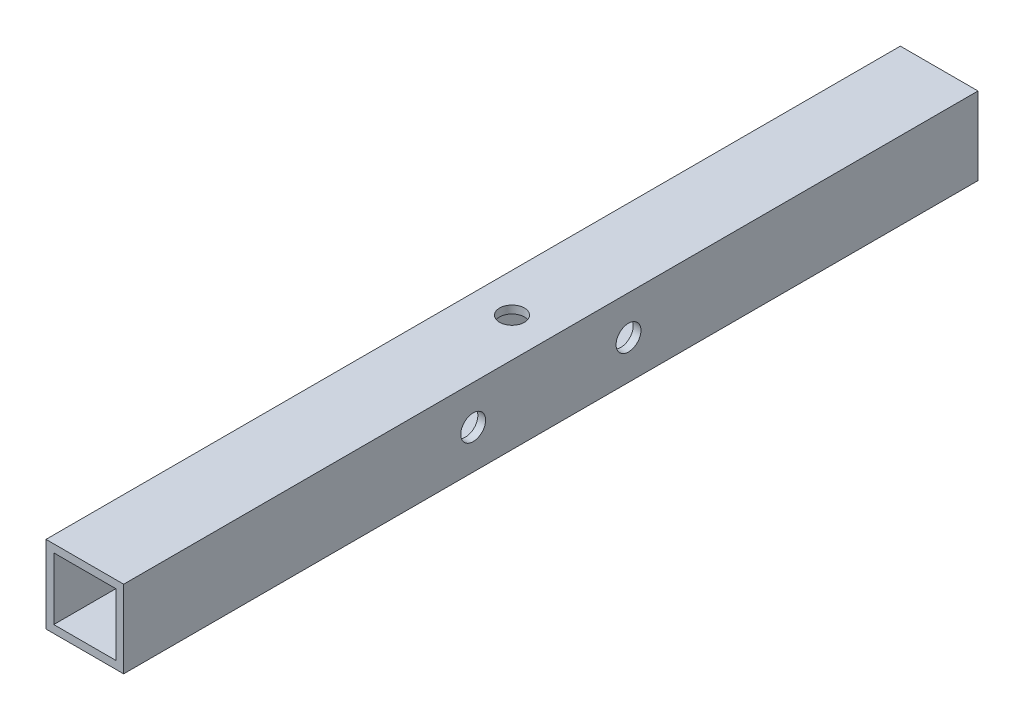
ISO-10303-21;
HEADER;
FILE_DESCRIPTION(('STEP AP214'),'2;1');
FILE_NAME('part.step','',(''),(''),'','','');
FILE_SCHEMA(('AUTOMOTIVE_DESIGN { 1 0 10303 214 1 1 1 1 }'));
ENDSEC;
DATA;
#1=APPLICATION_CONTEXT('core data for automotive mechanical design processes');
#2=APPLICATION_PROTOCOL_DEFINITION('international standard','automotive_design',2000,#1);
#3=PRODUCT_CONTEXT('',#1,'mechanical');
#4=PRODUCT('Part','Part','',(#3));
#5=PRODUCT_RELATED_PRODUCT_CATEGORY('part','',(#4));
#6=PRODUCT_DEFINITION_FORMATION('','',#4);
#7=PRODUCT_DEFINITION_CONTEXT('part definition',#1,'design');
#8=PRODUCT_DEFINITION('design','',#6,#7);
#9=PRODUCT_DEFINITION_SHAPE('','',#8);
#10=(LENGTH_UNIT() NAMED_UNIT(*) SI_UNIT(.MILLI.,.METRE.));
#11=(NAMED_UNIT(*) PLANE_ANGLE_UNIT() SI_UNIT($,.RADIAN.));
#12=(NAMED_UNIT(*) SI_UNIT($,.STERADIAN.) SOLID_ANGLE_UNIT());
#13=UNCERTAINTY_MEASURE_WITH_UNIT(LENGTH_MEASURE(1.E-05),#10,'distance_accuracy_value','');
#14=(GEOMETRIC_REPRESENTATION_CONTEXT(3) GLOBAL_UNCERTAINTY_ASSIGNED_CONTEXT((#13)) GLOBAL_UNIT_ASSIGNED_CONTEXT((#10,
#11,#12)) REPRESENTATION_CONTEXT('',''));
#15=CARTESIAN_POINT('',(0.,0.,0.));
#16=DIRECTION('',(0.,0.,1.));
#17=DIRECTION('',(1.,0.,0.));
#18=AXIS2_PLACEMENT_3D('',#15,#16,#17);
#19=CARTESIAN_POINT('',(0.,0.,110.));
#20=DIRECTION('',(0.,0.,-1.));
#21=DIRECTION('',(-1.,0.,0.));
#22=AXIS2_PLACEMENT_3D('',#19,#20,#21);
#23=PLANE('',#22);
#24=DIRECTION('',(0.,1.,0.));
#25=VECTOR('',#24,1.);
#26=CARTESIAN_POINT('',(5.,-5.,110.));
#27=LINE('',#26,#25);
#28=CARTESIAN_POINT('',(5.,-5.,110.));
#29=VERTEX_POINT('',#28);
#30=CARTESIAN_POINT('',(5.,5.,110.));
#31=VERTEX_POINT('',#30);
#32=EDGE_CURVE('E137',#29,#31,#27,.T.);
#33=ORIENTED_EDGE('',*,*,#32,.T.);
#34=DIRECTION('',(-1.,0.,0.));
#35=VECTOR('',#34,1.);
#36=CARTESIAN_POINT('',(-5.,5.,110.));
#37=LINE('',#36,#35);
#38=CARTESIAN_POINT('',(-5.,5.,110.));
#39=VERTEX_POINT('',#38);
#40=EDGE_CURVE('E140',#31,#39,#37,.T.);
#41=ORIENTED_EDGE('',*,*,#40,.T.);
#42=DIRECTION('',(0.,-1.,0.));
#43=VECTOR('',#42,1.);
#44=CARTESIAN_POINT('',(-5.,-5.,110.));
#45=LINE('',#44,#43);
#46=CARTESIAN_POINT('',(-5.,-5.,110.));
#47=VERTEX_POINT('',#46);
#48=EDGE_CURVE('E143',#39,#47,#45,.T.);
#49=ORIENTED_EDGE('',*,*,#48,.T.);
#50=DIRECTION('',(1.,0.,0.));
#51=VECTOR('',#50,1.);
#52=CARTESIAN_POINT('',(-5.,-5.,110.));
#53=LINE('',#52,#51);
#54=EDGE_CURVE('E145',#47,#29,#53,.T.);
#55=ORIENTED_EDGE('',*,*,#54,.T.);
#56=EDGE_LOOP('',(#33,#41,#49,#55));
#57=FACE_BOUND('',#56,.T.);
#58=DIRECTION('',(0.,1.,0.));
#59=VECTOR('',#58,1.);
#60=CARTESIAN_POINT('',(4.,-4.,110.));
#61=LINE('',#60,#59);
#62=CARTESIAN_POINT('',(4.,-4.,110.));
#63=VERTEX_POINT('',#62);
#64=CARTESIAN_POINT('',(4.,4.,110.));
#65=VERTEX_POINT('',#64);
#66=EDGE_CURVE('E99',#63,#65,#61,.T.);
#67=ORIENTED_EDGE('',*,*,#66,.F.);
#68=DIRECTION('',(1.,0.,0.));
#69=VECTOR('',#68,1.);
#70=CARTESIAN_POINT('',(-4.,-4.,110.));
#71=LINE('',#70,#69);
#72=CARTESIAN_POINT('',(-4.,-4.,110.));
#73=VERTEX_POINT('',#72);
#74=EDGE_CURVE('E121',#73,#63,#71,.T.);
#75=ORIENTED_EDGE('',*,*,#74,.F.);
#76=DIRECTION('',(0.,-1.,0.));
#77=VECTOR('',#76,1.);
#78=CARTESIAN_POINT('',(-4.,-4.,110.));
#79=LINE('',#78,#77);
#80=CARTESIAN_POINT('',(-4.,4.,110.));
#81=VERTEX_POINT('',#80);
#82=EDGE_CURVE('E119',#81,#73,#79,.T.);
#83=ORIENTED_EDGE('',*,*,#82,.F.);
#84=DIRECTION('',(-1.,0.,0.));
#85=VECTOR('',#84,1.);
#86=CARTESIAN_POINT('',(-4.,4.,110.));
#87=LINE('',#86,#85);
#88=EDGE_CURVE('E107',#65,#81,#87,.T.);
#89=ORIENTED_EDGE('',*,*,#88,.F.);
#90=EDGE_LOOP('',(#67,#75,#83,#89));
#91=FACE_BOUND('',#90,.T.);
#92=ADVANCED_FACE('F32',(#57,#91),#23,.F.);
#93=CARTESIAN_POINT('',(0.,0.,0.));
#94=DIRECTION('',(0.,0.,-1.));
#95=DIRECTION('',(-1.,0.,0.));
#96=AXIS2_PLACEMENT_3D('',#93,#94,#95);
#97=PLANE('',#96);
#98=DIRECTION('',(0.,1.,0.));
#99=VECTOR('',#98,1.);
#100=CARTESIAN_POINT('',(5.,-5.,0.));
#101=LINE('',#100,#99);
#102=CARTESIAN_POINT('',(5.,-5.,0.));
#103=VERTEX_POINT('',#102);
#104=CARTESIAN_POINT('',(5.,5.,0.));
#105=VERTEX_POINT('',#104);
#106=EDGE_CURVE('E115',#103,#105,#101,.T.);
#107=ORIENTED_EDGE('',*,*,#106,.F.);
#108=DIRECTION('',(1.,0.,0.));
#109=VECTOR('',#108,1.);
#110=CARTESIAN_POINT('',(-5.,-5.,0.));
#111=LINE('',#110,#109);
#112=CARTESIAN_POINT('',(-5.,-5.,0.));
#113=VERTEX_POINT('',#112);
#114=EDGE_CURVE('E141',#113,#103,#111,.T.);
#115=ORIENTED_EDGE('',*,*,#114,.F.);
#116=DIRECTION('',(0.,-1.,0.));
#117=VECTOR('',#116,1.);
#118=CARTESIAN_POINT('',(-5.,-5.,0.));
#119=LINE('',#118,#117);
#120=CARTESIAN_POINT('',(-5.,5.,0.));
#121=VERTEX_POINT('',#120);
#122=EDGE_CURVE('E152',#121,#113,#119,.T.);
#123=ORIENTED_EDGE('',*,*,#122,.F.);
#124=DIRECTION('',(-1.,0.,0.));
#125=VECTOR('',#124,1.);
#126=CARTESIAN_POINT('',(-5.,5.,0.));
#127=LINE('',#126,#125);
#128=EDGE_CURVE('E150',#105,#121,#127,.T.);
#129=ORIENTED_EDGE('',*,*,#128,.F.);
#130=EDGE_LOOP('',(#107,#115,#123,#129));
#131=FACE_BOUND('',#130,.T.);
#132=DIRECTION('',(1.,0.,0.));
#133=VECTOR('',#132,1.);
#134=CARTESIAN_POINT('',(-4.,-4.,0.));
#135=LINE('',#134,#133);
#136=CARTESIAN_POINT('',(-4.,-4.,0.));
#137=VERTEX_POINT('',#136);
#138=CARTESIAN_POINT('',(4.,-4.,0.));
#139=VERTEX_POINT('',#138);
#140=EDGE_CURVE('E108',#137,#139,#135,.T.);
#141=ORIENTED_EDGE('',*,*,#140,.T.);
#142=DIRECTION('',(0.,1.,0.));
#143=VECTOR('',#142,1.);
#144=CARTESIAN_POINT('',(4.,-4.,0.));
#145=LINE('',#144,#143);
#146=CARTESIAN_POINT('',(4.,4.,0.));
#147=VERTEX_POINT('',#146);
#148=EDGE_CURVE('E57',#139,#147,#145,.T.);
#149=ORIENTED_EDGE('',*,*,#148,.T.);
#150=DIRECTION('',(-1.,0.,0.));
#151=VECTOR('',#150,1.);
#152=CARTESIAN_POINT('',(-4.,4.,0.));
#153=LINE('',#152,#151);
#154=CARTESIAN_POINT('',(-4.,4.,0.));
#155=VERTEX_POINT('',#154);
#156=EDGE_CURVE('E114',#147,#155,#153,.T.);
#157=ORIENTED_EDGE('',*,*,#156,.T.);
#158=DIRECTION('',(0.,-1.,0.));
#159=VECTOR('',#158,1.);
#160=CARTESIAN_POINT('',(-4.,-4.,0.));
#161=LINE('',#160,#159);
#162=EDGE_CURVE('E129',#155,#137,#161,.T.);
#163=ORIENTED_EDGE('',*,*,#162,.T.);
#164=EDGE_LOOP('',(#141,#149,#157,#163));
#165=FACE_BOUND('',#164,.T.);
#166=ADVANCED_FACE('F214',(#131,#165),#97,.T.);
#167=CARTESIAN_POINT('',(5.,-5.,110.));
#168=DIRECTION('',(-1.,0.,0.));
#169=DIRECTION('',(0.,0.,1.));
#170=AXIS2_PLACEMENT_3D('',#167,#168,#169);
#171=PLANE('',#170);
#172=CARTESIAN_POINT('',(5.,0.,65.));
#173=DIRECTION('',(1.,0.,0.));
#174=DIRECTION('',(0.,0.,-1.));
#175=AXIS2_PLACEMENT_3D('',#172,#173,#174);
#176=CIRCLE('',#175,1.60000000000001);
#177=CARTESIAN_POINT('',(5.,0.,63.4));
#178=VERTEX_POINT('',#177);
#179=EDGE_CURVE('E174',#178,#178,#176,.T.);
#180=ORIENTED_EDGE('',*,*,#179,.F.);
#181=EDGE_LOOP('',(#180));
#182=FACE_BOUND('',#181,.T.);
#183=CARTESIAN_POINT('',(5.,0.,45.));
#184=DIRECTION('',(1.,0.,0.));
#185=DIRECTION('',(0.,0.,-1.));
#186=AXIS2_PLACEMENT_3D('',#183,#184,#185);
#187=CIRCLE('',#186,1.6);
#188=CARTESIAN_POINT('',(5.,0.,43.4));
#189=VERTEX_POINT('',#188);
#190=EDGE_CURVE('E184',#189,#189,#187,.T.);
#191=ORIENTED_EDGE('',*,*,#190,.F.);
#192=EDGE_LOOP('',(#191));
#193=FACE_BOUND('',#192,.T.);
#194=ORIENTED_EDGE('',*,*,#106,.T.);
#195=DIRECTION('',(0.,0.,-1.));
#196=VECTOR('',#195,1.);
#197=CARTESIAN_POINT('',(5.,5.,110.));
#198=LINE('',#197,#196);
#199=EDGE_CURVE('E11',#31,#105,#198,.T.);
#200=ORIENTED_EDGE('',*,*,#199,.F.);
#201=ORIENTED_EDGE('',*,*,#32,.F.);
#202=DIRECTION('',(0.,0.,-1.));
#203=VECTOR('',#202,1.);
#204=CARTESIAN_POINT('',(5.,-5.,110.));
#205=LINE('',#204,#203);
#206=EDGE_CURVE('E147',#29,#103,#205,.T.);
#207=ORIENTED_EDGE('',*,*,#206,.T.);
#208=EDGE_LOOP('',(#194,#200,#201,#207));
#209=FACE_BOUND('',#208,.T.);
#210=ADVANCED_FACE('F34',(#182,#193,#209),#171,.F.);
#211=CARTESIAN_POINT('',(-5.,5.,110.));
#212=DIRECTION('',(0.,-1.,0.));
#213=DIRECTION('',(0.,0.,-1.));
#214=AXIS2_PLACEMENT_3D('',#211,#212,#213);
#215=PLANE('',#214);
#216=CARTESIAN_POINT('',(0.,5.,55.));
#217=DIRECTION('',(0.,1.,0.));
#218=DIRECTION('',(0.,0.,1.));
#219=AXIS2_PLACEMENT_3D('',#216,#217,#218);
#220=CIRCLE('',#219,1.6);
#221=CARTESIAN_POINT('',(0.,5.,56.6));
#222=VERTEX_POINT('',#221);
#223=EDGE_CURVE('E190',#222,#222,#220,.T.);
#224=ORIENTED_EDGE('',*,*,#223,.F.);
#225=EDGE_LOOP('',(#224));
#226=FACE_BOUND('',#225,.T.);
#227=ORIENTED_EDGE('',*,*,#128,.T.);
#228=DIRECTION('',(0.,0.,-1.));
#229=VECTOR('',#228,1.);
#230=CARTESIAN_POINT('',(-5.,5.,110.));
#231=LINE('',#230,#229);
#232=EDGE_CURVE('E41',#39,#121,#231,.T.);
#233=ORIENTED_EDGE('',*,*,#232,.F.);
#234=ORIENTED_EDGE('',*,*,#40,.F.);
#235=ORIENTED_EDGE('',*,*,#199,.T.);
#236=EDGE_LOOP('',(#227,#233,#234,#235));
#237=FACE_BOUND('',#236,.T.);
#238=ADVANCED_FACE('F228',(#226,#237),#215,.F.);
#239=CARTESIAN_POINT('',(-5.,-5.,110.));
#240=DIRECTION('',(1.,0.,0.));
#241=DIRECTION('',(0.,0.,-1.));
#242=AXIS2_PLACEMENT_3D('',#239,#240,#241);
#243=PLANE('',#242);
#244=CARTESIAN_POINT('',(-5.,0.,65.));
#245=DIRECTION('',(1.,0.,0.));
#246=DIRECTION('',(0.,0.,-1.));
#247=AXIS2_PLACEMENT_3D('',#244,#245,#246);
#248=CIRCLE('',#247,1.60000000000001);
#249=CARTESIAN_POINT('',(-5.,0.,63.4));
#250=VERTEX_POINT('',#249);
#251=EDGE_CURVE('E168',#250,#250,#248,.T.);
#252=ORIENTED_EDGE('',*,*,#251,.T.);
#253=EDGE_LOOP('',(#252));
#254=FACE_BOUND('',#253,.T.);
#255=CARTESIAN_POINT('',(-5.,0.,45.));
#256=DIRECTION('',(1.,0.,0.));
#257=DIRECTION('',(0.,0.,-1.));
#258=AXIS2_PLACEMENT_3D('',#255,#256,#257);
#259=CIRCLE('',#258,1.6);
#260=CARTESIAN_POINT('',(-5.,0.,43.4));
#261=VERTEX_POINT('',#260);
#262=EDGE_CURVE('E179',#261,#261,#259,.T.);
#263=ORIENTED_EDGE('',*,*,#262,.T.);
#264=EDGE_LOOP('',(#263));
#265=FACE_BOUND('',#264,.T.);
#266=ORIENTED_EDGE('',*,*,#122,.T.);
#267=DIRECTION('',(0.,0.,-1.));
#268=VECTOR('',#267,1.);
#269=CARTESIAN_POINT('',(-5.,-5.,110.));
#270=LINE('',#269,#268);
#271=EDGE_CURVE('E157',#47,#113,#270,.T.);
#272=ORIENTED_EDGE('',*,*,#271,.F.);
#273=ORIENTED_EDGE('',*,*,#48,.F.);
#274=ORIENTED_EDGE('',*,*,#232,.T.);
#275=EDGE_LOOP('',(#266,#272,#273,#274));
#276=FACE_BOUND('',#275,.T.);
#277=ADVANCED_FACE('F225',(#254,#265,#276),#243,.F.);
#278=CARTESIAN_POINT('',(-5.,-5.,110.));
#279=DIRECTION('',(0.,1.,0.));
#280=DIRECTION('',(0.,0.,1.));
#281=AXIS2_PLACEMENT_3D('',#278,#279,#280);
#282=PLANE('',#281);
#283=CARTESIAN_POINT('',(0.,-5.,55.));
#284=DIRECTION('',(0.,1.,0.));
#285=DIRECTION('',(0.,0.,1.));
#286=AXIS2_PLACEMENT_3D('',#283,#284,#285);
#287=CIRCLE('',#286,1.6);
#288=CARTESIAN_POINT('',(0.,-5.,56.6));
#289=VERTEX_POINT('',#288);
#290=EDGE_CURVE('E164',#289,#289,#287,.T.);
#291=ORIENTED_EDGE('',*,*,#290,.T.);
#292=EDGE_LOOP('',(#291));
#293=FACE_BOUND('',#292,.T.);
#294=ORIENTED_EDGE('',*,*,#114,.T.);
#295=ORIENTED_EDGE('',*,*,#206,.F.);
#296=ORIENTED_EDGE('',*,*,#54,.F.);
#297=ORIENTED_EDGE('',*,*,#271,.T.);
#298=EDGE_LOOP('',(#294,#295,#296,#297));
#299=FACE_BOUND('',#298,.T.);
#300=ADVANCED_FACE('F210',(#293,#299),#282,.F.);
#301=CARTESIAN_POINT('',(4.,-4.,110.));
#302=DIRECTION('',(-1.,0.,0.));
#303=DIRECTION('',(0.,0.,1.));
#304=AXIS2_PLACEMENT_3D('',#301,#302,#303);
#305=PLANE('',#304);
#306=CARTESIAN_POINT('',(4.,0.,65.));
#307=DIRECTION('',(-1.,0.,0.));
#308=DIRECTION('',(0.,0.,1.));
#309=AXIS2_PLACEMENT_3D('',#306,#307,#308);
#310=CIRCLE('',#309,1.60000000000001);
#311=CARTESIAN_POINT('',(4.,0.,66.6));
#312=VERTEX_POINT('',#311);
#313=EDGE_CURVE('E187',#312,#312,#310,.T.);
#314=ORIENTED_EDGE('',*,*,#313,.F.);
#315=EDGE_LOOP('',(#314));
#316=FACE_BOUND('',#315,.T.);
#317=CARTESIAN_POINT('',(4.,0.,45.));
#318=DIRECTION('',(-1.,0.,0.));
#319=DIRECTION('',(0.,0.,1.));
#320=AXIS2_PLACEMENT_3D('',#317,#318,#319);
#321=CIRCLE('',#320,1.6);
#322=CARTESIAN_POINT('',(4.,0.,46.6));
#323=VERTEX_POINT('',#322);
#324=EDGE_CURVE('E167',#323,#323,#321,.T.);
#325=ORIENTED_EDGE('',*,*,#324,.F.);
#326=EDGE_LOOP('',(#325));
#327=FACE_BOUND('',#326,.T.);
#328=ORIENTED_EDGE('',*,*,#148,.F.);
#329=DIRECTION('',(0.,0.,-1.));
#330=VECTOR('',#329,1.);
#331=CARTESIAN_POINT('',(4.,-4.,110.));
#332=LINE('',#331,#330);
#333=EDGE_CURVE('E103',#63,#139,#332,.T.);
#334=ORIENTED_EDGE('',*,*,#333,.F.);
#335=ORIENTED_EDGE('',*,*,#66,.T.);
#336=DIRECTION('',(0.,0.,-1.));
#337=VECTOR('',#336,1.);
#338=CARTESIAN_POINT('',(4.,4.,110.));
#339=LINE('',#338,#337);
#340=EDGE_CURVE('E102',#65,#147,#339,.T.);
#341=ORIENTED_EDGE('',*,*,#340,.T.);
#342=EDGE_LOOP('',(#328,#334,#335,#341));
#343=FACE_BOUND('',#342,.T.);
#344=ADVANCED_FACE('F101',(#316,#327,#343),#305,.T.);
#345=CARTESIAN_POINT('',(-4.,4.,110.));
#346=DIRECTION('',(0.,-1.,0.));
#347=DIRECTION('',(0.,0.,-1.));
#348=AXIS2_PLACEMENT_3D('',#345,#346,#347);
#349=PLANE('',#348);
#350=CARTESIAN_POINT('',(0.,4.,55.));
#351=DIRECTION('',(0.,-1.,0.));
#352=DIRECTION('',(0.,0.,-1.));
#353=AXIS2_PLACEMENT_3D('',#350,#351,#352);
#354=CIRCLE('',#353,1.6);
#355=CARTESIAN_POINT('',(0.,4.,53.4));
#356=VERTEX_POINT('',#355);
#357=EDGE_CURVE('E127',#356,#356,#354,.T.);
#358=ORIENTED_EDGE('',*,*,#357,.F.);
#359=EDGE_LOOP('',(#358));
#360=FACE_BOUND('',#359,.T.);
#361=ORIENTED_EDGE('',*,*,#156,.F.);
#362=ORIENTED_EDGE('',*,*,#340,.F.);
#363=ORIENTED_EDGE('',*,*,#88,.T.);
#364=DIRECTION('',(0.,0.,-1.));
#365=VECTOR('',#364,1.);
#366=CARTESIAN_POINT('',(-4.,4.,110.));
#367=LINE('',#366,#365);
#368=EDGE_CURVE('E116',#81,#155,#367,.T.);
#369=ORIENTED_EDGE('',*,*,#368,.T.);
#370=EDGE_LOOP('',(#361,#362,#363,#369));
#371=FACE_BOUND('',#370,.T.);
#372=ADVANCED_FACE('F111',(#360,#371),#349,.T.);
#373=CARTESIAN_POINT('',(-4.,-4.,110.));
#374=DIRECTION('',(1.,0.,0.));
#375=DIRECTION('',(0.,0.,-1.));
#376=AXIS2_PLACEMENT_3D('',#373,#374,#375);
#377=PLANE('',#376);
#378=CARTESIAN_POINT('',(-4.,0.,65.));
#379=DIRECTION('',(1.,0.,0.));
#380=DIRECTION('',(0.,0.,-1.));
#381=AXIS2_PLACEMENT_3D('',#378,#379,#380);
#382=CIRCLE('',#381,1.60000000000001);
#383=CARTESIAN_POINT('',(-4.,0.,63.4));
#384=VERTEX_POINT('',#383);
#385=EDGE_CURVE('E36',#384,#384,#382,.T.);
#386=ORIENTED_EDGE('',*,*,#385,.F.);
#387=EDGE_LOOP('',(#386));
#388=FACE_BOUND('',#387,.T.);
#389=CARTESIAN_POINT('',(-4.,0.,45.));
#390=DIRECTION('',(1.,0.,0.));
#391=DIRECTION('',(0.,0.,-1.));
#392=AXIS2_PLACEMENT_3D('',#389,#390,#391);
#393=CIRCLE('',#392,1.6);
#394=CARTESIAN_POINT('',(-4.,0.,43.4));
#395=VERTEX_POINT('',#394);
#396=EDGE_CURVE('E165',#395,#395,#393,.T.);
#397=ORIENTED_EDGE('',*,*,#396,.F.);
#398=EDGE_LOOP('',(#397));
#399=FACE_BOUND('',#398,.T.);
#400=ORIENTED_EDGE('',*,*,#162,.F.);
#401=ORIENTED_EDGE('',*,*,#368,.F.);
#402=ORIENTED_EDGE('',*,*,#82,.T.);
#403=DIRECTION('',(0.,0.,-1.));
#404=VECTOR('',#403,1.);
#405=CARTESIAN_POINT('',(-4.,-4.,110.));
#406=LINE('',#405,#404);
#407=EDGE_CURVE('E49',#73,#137,#406,.T.);
#408=ORIENTED_EDGE('',*,*,#407,.T.);
#409=EDGE_LOOP('',(#400,#401,#402,#408));
#410=FACE_BOUND('',#409,.T.);
#411=ADVANCED_FACE('F201',(#388,#399,#410),#377,.T.);
#412=CARTESIAN_POINT('',(-4.,-4.,110.));
#413=DIRECTION('',(0.,1.,0.));
#414=DIRECTION('',(0.,0.,1.));
#415=AXIS2_PLACEMENT_3D('',#412,#413,#414);
#416=PLANE('',#415);
#417=CARTESIAN_POINT('',(0.,-4.,55.));
#418=DIRECTION('',(0.,1.,0.));
#419=DIRECTION('',(0.,0.,1.));
#420=AXIS2_PLACEMENT_3D('',#417,#418,#419);
#421=CIRCLE('',#420,1.6);
#422=CARTESIAN_POINT('',(0.,-4.,56.6));
#423=VERTEX_POINT('',#422);
#424=EDGE_CURVE('E162',#423,#423,#421,.T.);
#425=ORIENTED_EDGE('',*,*,#424,.F.);
#426=EDGE_LOOP('',(#425));
#427=FACE_BOUND('',#426,.T.);
#428=ORIENTED_EDGE('',*,*,#140,.F.);
#429=ORIENTED_EDGE('',*,*,#407,.F.);
#430=ORIENTED_EDGE('',*,*,#74,.T.);
#431=ORIENTED_EDGE('',*,*,#333,.T.);
#432=EDGE_LOOP('',(#428,#429,#430,#431));
#433=FACE_BOUND('',#432,.T.);
#434=ADVANCED_FACE('F207',(#427,#433),#416,.T.);
#435=CARTESIAN_POINT('',(0.,-5.,55.));
#436=DIRECTION('',(0.,1.,0.));
#437=DIRECTION('',(0.,0.,1.));
#438=AXIS2_PLACEMENT_3D('',#435,#436,#437);
#439=CYLINDRICAL_SURFACE('',#438,1.6);
#440=ORIENTED_EDGE('',*,*,#424,.T.);
#441=EDGE_LOOP('',(#440));
#442=FACE_BOUND('',#441,.T.);
#443=ORIENTED_EDGE('',*,*,#290,.F.);
#444=EDGE_LOOP('',(#443));
#445=FACE_BOUND('',#444,.T.);
#446=ADVANCED_FACE('F253',(#442,#445),#439,.F.);
#447=ORIENTED_EDGE('',*,*,#357,.T.);
#448=EDGE_LOOP('',(#447));
#449=FACE_BOUND('',#448,.T.);
#450=ORIENTED_EDGE('',*,*,#223,.T.);
#451=EDGE_LOOP('',(#450));
#452=FACE_BOUND('',#451,.T.);
#453=ADVANCED_FACE('F197',(#449,#452),#439,.F.);
#454=CARTESIAN_POINT('',(-5.,0.,45.));
#455=DIRECTION('',(1.,0.,0.));
#456=DIRECTION('',(0.,0.,-1.));
#457=AXIS2_PLACEMENT_3D('',#454,#455,#456);
#458=CYLINDRICAL_SURFACE('',#457,1.6);
#459=ORIENTED_EDGE('',*,*,#396,.T.);
#460=EDGE_LOOP('',(#459));
#461=FACE_BOUND('',#460,.T.);
#462=ORIENTED_EDGE('',*,*,#262,.F.);
#463=EDGE_LOOP('',(#462));
#464=FACE_BOUND('',#463,.T.);
#465=ADVANCED_FACE('F263',(#461,#464),#458,.F.);
#466=CARTESIAN_POINT('',(-5.,0.,65.));
#467=DIRECTION('',(1.,0.,0.));
#468=DIRECTION('',(0.,0.,-1.));
#469=AXIS2_PLACEMENT_3D('',#466,#467,#468);
#470=CYLINDRICAL_SURFACE('',#469,1.60000000000001);
#471=ORIENTED_EDGE('',*,*,#385,.T.);
#472=EDGE_LOOP('',(#471));
#473=FACE_BOUND('',#472,.T.);
#474=ORIENTED_EDGE('',*,*,#251,.F.);
#475=EDGE_LOOP('',(#474));
#476=FACE_BOUND('',#475,.T.);
#477=ADVANCED_FACE('F266',(#473,#476),#470,.F.);
#478=ORIENTED_EDGE('',*,*,#324,.T.);
#479=EDGE_LOOP('',(#478));
#480=FACE_BOUND('',#479,.T.);
#481=ORIENTED_EDGE('',*,*,#190,.T.);
#482=EDGE_LOOP('',(#481));
#483=FACE_BOUND('',#482,.T.);
#484=ADVANCED_FACE('F267',(#480,#483),#458,.F.);
#485=ORIENTED_EDGE('',*,*,#313,.T.);
#486=EDGE_LOOP('',(#485));
#487=FACE_BOUND('',#486,.T.);
#488=ORIENTED_EDGE('',*,*,#179,.T.);
#489=EDGE_LOOP('',(#488));
#490=FACE_BOUND('',#489,.T.);
#491=ADVANCED_FACE('F270',(#487,#490),#470,.F.);
#492=CLOSED_SHELL('',(#92,#166,#210,#238,#277,#300,#344,#372,#411,#434,#446,#453,#465,#477,#484,#491));
#493=MANIFOLD_SOLID_BREP('B2',#492);
#494=ADVANCED_BREP_SHAPE_REPRESENTATION('',(#18,#493),#14);
#495=SHAPE_DEFINITION_REPRESENTATION(#9,#494);
ENDSEC;
END-ISO-10303-21;
